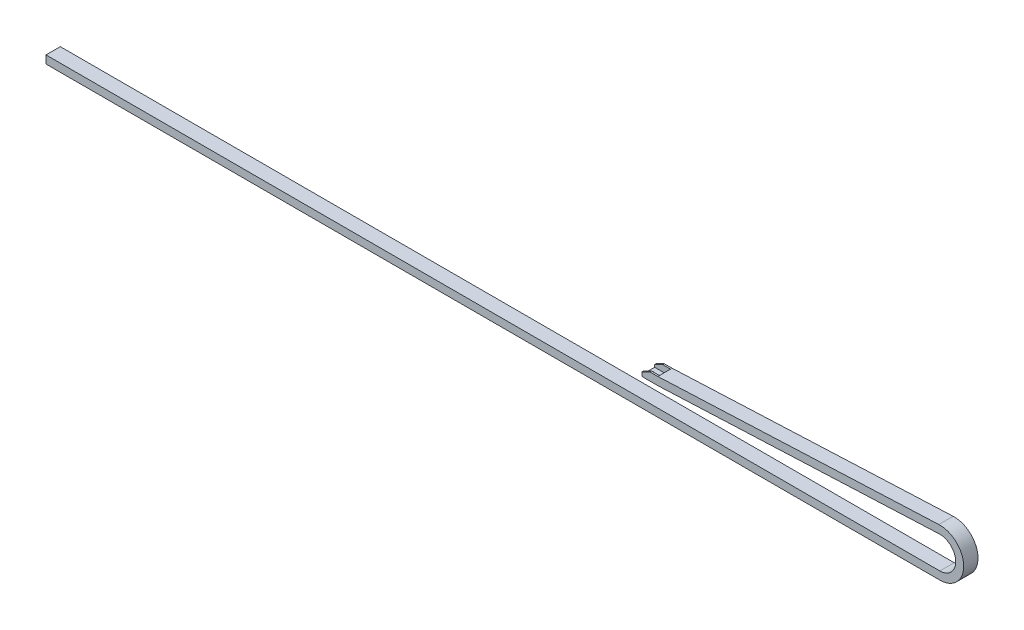
ISO-10303-21;
HEADER;
FILE_DESCRIPTION(('STEP AP214'),'2;1');
FILE_NAME('part.step','',(''),(''),'','','');
FILE_SCHEMA(('AUTOMOTIVE_DESIGN { 1 0 10303 214 1 1 1 1 }'));
ENDSEC;
DATA;
#1=APPLICATION_CONTEXT('core data for automotive mechanical design processes');
#2=APPLICATION_PROTOCOL_DEFINITION('international standard','automotive_design',2000,#1);
#3=PRODUCT_CONTEXT('',#1,'mechanical');
#4=PRODUCT('Part','Part','',(#3));
#5=PRODUCT_RELATED_PRODUCT_CATEGORY('part','',(#4));
#6=PRODUCT_DEFINITION_FORMATION('','',#4);
#7=PRODUCT_DEFINITION_CONTEXT('part definition',#1,'design');
#8=PRODUCT_DEFINITION('design','',#6,#7);
#9=PRODUCT_DEFINITION_SHAPE('','',#8);
#10=(LENGTH_UNIT() NAMED_UNIT(*) SI_UNIT(.MILLI.,.METRE.));
#11=(NAMED_UNIT(*) PLANE_ANGLE_UNIT() SI_UNIT($,.RADIAN.));
#12=(NAMED_UNIT(*) SI_UNIT($,.STERADIAN.) SOLID_ANGLE_UNIT());
#13=UNCERTAINTY_MEASURE_WITH_UNIT(LENGTH_MEASURE(1.E-05),#10,'distance_accuracy_value','');
#14=(GEOMETRIC_REPRESENTATION_CONTEXT(3) GLOBAL_UNCERTAINTY_ASSIGNED_CONTEXT((#13)) GLOBAL_UNIT_ASSIGNED_CONTEXT((#10,
#11,#12)) REPRESENTATION_CONTEXT('',''));
#15=CARTESIAN_POINT('',(0.,0.,0.));
#16=DIRECTION('',(0.,0.,1.));
#17=DIRECTION('',(1.,0.,0.));
#18=AXIS2_PLACEMENT_3D('',#15,#16,#17);
#19=CARTESIAN_POINT('',(0.,0.,18.));
#20=DIRECTION('',(1.,0.,0.));
#21=DIRECTION('',(0.,0.,-1.));
#22=AXIS2_PLACEMENT_3D('',#19,#20,#21);
#23=PLANE('',#22);
#24=DIRECTION('',(0.,-1.,0.));
#25=VECTOR('',#24,1.);
#26=CARTESIAN_POINT('',(0.,0.,0.));
#27=LINE('',#26,#25);
#28=CARTESIAN_POINT('',(0.,10.,0.));
#29=VERTEX_POINT('',#28);
#30=CARTESIAN_POINT('',(0.,0.,0.));
#31=VERTEX_POINT('',#30);
#32=EDGE_CURVE('E285',#29,#31,#27,.T.);
#33=ORIENTED_EDGE('',*,*,#32,.T.);
#34=DIRECTION('',(0.,0.,-1.));
#35=VECTOR('',#34,1.);
#36=CARTESIAN_POINT('',(0.,0.,18.));
#37=LINE('',#36,#35);
#38=CARTESIAN_POINT('',(0.,0.,18.));
#39=VERTEX_POINT('',#38);
#40=EDGE_CURVE('E48',#39,#31,#37,.T.);
#41=ORIENTED_EDGE('',*,*,#40,.F.);
#42=DIRECTION('',(0.,-1.,0.));
#43=VECTOR('',#42,1.);
#44=CARTESIAN_POINT('',(0.,0.,18.));
#45=LINE('',#44,#43);
#46=CARTESIAN_POINT('',(0.,10.,18.));
#47=VERTEX_POINT('',#46);
#48=EDGE_CURVE('E317',#47,#39,#45,.T.);
#49=ORIENTED_EDGE('',*,*,#48,.F.);
#50=DIRECTION('',(0.,0.,-1.));
#51=VECTOR('',#50,1.);
#52=CARTESIAN_POINT('',(0.,10.,18.));
#53=LINE('',#52,#51);
#54=EDGE_CURVE('E352',#47,#29,#53,.T.);
#55=ORIENTED_EDGE('',*,*,#54,.T.);
#56=EDGE_LOOP('',(#33,#41,#49,#55));
#57=FACE_BOUND('',#56,.T.);
#58=DIRECTION('',(0.,-1.,0.));
#59=VECTOR('',#58,1.);
#60=CARTESIAN_POINT('',(0.,0.,2.));
#61=LINE('',#60,#59);
#62=CARTESIAN_POINT('',(0.,8.,2.));
#63=VERTEX_POINT('',#62);
#64=CARTESIAN_POINT('',(0.,2.,2.));
#65=VERTEX_POINT('',#64);
#66=EDGE_CURVE('E208',#63,#65,#61,.T.);
#67=ORIENTED_EDGE('',*,*,#66,.F.);
#68=DIRECTION('',(0.,0.,-1.));
#69=VECTOR('',#68,1.);
#70=CARTESIAN_POINT('',(0.,8.,18.));
#71=LINE('',#70,#69);
#72=CARTESIAN_POINT('',(0.,8.,16.));
#73=VERTEX_POINT('',#72);
#74=EDGE_CURVE('E256',#73,#63,#71,.T.);
#75=ORIENTED_EDGE('',*,*,#74,.F.);
#76=DIRECTION('',(0.,-1.,0.));
#77=VECTOR('',#76,1.);
#78=CARTESIAN_POINT('',(0.,0.,16.));
#79=LINE('',#78,#77);
#80=CARTESIAN_POINT('',(0.,2.,16.));
#81=VERTEX_POINT('',#80);
#82=EDGE_CURVE('E63',#73,#81,#79,.T.);
#83=ORIENTED_EDGE('',*,*,#82,.T.);
#84=DIRECTION('',(0.,0.,-1.));
#85=VECTOR('',#84,1.);
#86=CARTESIAN_POINT('',(0.,2.,18.));
#87=LINE('',#86,#85);
#88=EDGE_CURVE('E221',#81,#65,#87,.T.);
#89=ORIENTED_EDGE('',*,*,#88,.T.);
#90=EDGE_LOOP('',(#67,#75,#83,#89));
#91=FACE_BOUND('',#90,.T.);
#92=ADVANCED_FACE('F45',(#57,#91),#23,.F.);
#93=CARTESIAN_POINT('',(760.,44.4904347529898,18.));
#94=DIRECTION('',(0.,-1.,0.));
#95=DIRECTION('',(0.,0.,-1.));
#96=AXIS2_PLACEMENT_3D('',#93,#94,#95);
#97=PLANE('',#96);
#98=DIRECTION('',(-1.,0.,0.));
#99=VECTOR('',#98,1.);
#100=CARTESIAN_POINT('',(760.,44.4904347529898,2.));
#101=LINE('',#100,#99);
#102=CARTESIAN_POINT('',(770.,44.4904347529898,2.));
#103=VERTEX_POINT('',#102);
#104=CARTESIAN_POINT('',(760.,44.4904347529898,2.));
#105=VERTEX_POINT('',#104);
#106=EDGE_CURVE('E11',#103,#105,#101,.T.);
#107=ORIENTED_EDGE('',*,*,#106,.F.);
#108=DIRECTION('',(0.,0.,-1.));
#109=VECTOR('',#108,1.);
#110=CARTESIAN_POINT('',(770.,44.4904347529898,18.));
#111=LINE('',#110,#109);
#112=CARTESIAN_POINT('',(770.,44.4904347529898,0.));
#113=VERTEX_POINT('',#112);
#114=EDGE_CURVE('E417',#103,#113,#111,.T.);
#115=ORIENTED_EDGE('',*,*,#114,.T.);
#116=DIRECTION('',(-1.,0.,0.));
#117=VECTOR('',#116,1.);
#118=CARTESIAN_POINT('',(760.,44.4904347529898,0.));
#119=LINE('',#118,#117);
#120=CARTESIAN_POINT('',(760.,44.4904347529898,0.));
#121=VERTEX_POINT('',#120);
#122=EDGE_CURVE('E366',#113,#121,#119,.T.);
#123=ORIENTED_EDGE('',*,*,#122,.T.);
#124=DIRECTION('',(0.,0.,-1.));
#125=VECTOR('',#124,1.);
#126=CARTESIAN_POINT('',(760.,44.4904347529898,18.));
#127=LINE('',#126,#125);
#128=EDGE_CURVE('E412',#105,#121,#127,.T.);
#129=ORIENTED_EDGE('',*,*,#128,.F.);
#130=EDGE_LOOP('',(#107,#115,#123,#129));
#131=FACE_BOUND('',#130,.T.);
#132=ADVANCED_FACE('F465',(#131),#97,.F.);
#133=CARTESIAN_POINT('',(750.,39.5,18.));
#134=DIRECTION('',(0.446528769332539,-0.894769276494431,0.));
#135=DIRECTION('',(0.894769276494431,0.446528769332539,0.));
#136=AXIS2_PLACEMENT_3D('',#133,#134,#135);
#137=PLANE('',#136);
#138=DIRECTION('',(-0.894769276494431,-0.446528769332539,0.));
#139=VECTOR('',#138,1.);
#140=CARTESIAN_POINT('',(750.,39.5,2.));
#141=LINE('',#140,#139);
#142=CARTESIAN_POINT('',(750.,39.5,2.));
#143=VERTEX_POINT('',#142);
#144=EDGE_CURVE('E299',#105,#143,#141,.T.);
#145=ORIENTED_EDGE('',*,*,#144,.F.);
#146=ORIENTED_EDGE('',*,*,#128,.T.);
#147=DIRECTION('',(-0.894769276494432,-0.446528769332539,0.));
#148=VECTOR('',#147,1.);
#149=CARTESIAN_POINT('',(750.,39.5,0.));
#150=LINE('',#149,#148);
#151=CARTESIAN_POINT('',(750.,39.5,0.));
#152=VERTEX_POINT('',#151);
#153=EDGE_CURVE('E370',#121,#152,#150,.T.);
#154=ORIENTED_EDGE('',*,*,#153,.T.);
#155=DIRECTION('',(0.,0.,-1.));
#156=VECTOR('',#155,1.);
#157=CARTESIAN_POINT('',(750.,39.5,18.));
#158=LINE('',#157,#156);
#159=EDGE_CURVE('E407',#143,#152,#158,.T.);
#160=ORIENTED_EDGE('',*,*,#159,.F.);
#161=EDGE_LOOP('',(#145,#146,#154,#160));
#162=FACE_BOUND('',#161,.T.);
#163=ADVANCED_FACE('F478',(#162),#137,.F.);
#164=CARTESIAN_POINT('',(750.,34.5,18.));
#165=DIRECTION('',(1.,0.,0.));
#166=DIRECTION('',(0.,0.,-1.));
#167=AXIS2_PLACEMENT_3D('',#164,#165,#166);
#168=PLANE('',#167);
#169=DIRECTION('',(0.,-1.,0.));
#170=VECTOR('',#169,1.);
#171=CARTESIAN_POINT('',(750.,34.5,2.));
#172=LINE('',#171,#170);
#173=CARTESIAN_POINT('',(750.,36.5,2.));
#174=VERTEX_POINT('',#173);
#175=EDGE_CURVE('E261',#143,#174,#172,.T.);
#176=ORIENTED_EDGE('',*,*,#175,.F.);
#177=ORIENTED_EDGE('',*,*,#159,.T.);
#178=DIRECTION('',(0.,-1.,0.));
#179=VECTOR('',#178,1.);
#180=CARTESIAN_POINT('',(750.,34.5,0.));
#181=LINE('',#180,#179);
#182=CARTESIAN_POINT('',(750.,34.5,0.));
#183=VERTEX_POINT('',#182);
#184=EDGE_CURVE('E374',#152,#183,#181,.T.);
#185=ORIENTED_EDGE('',*,*,#184,.T.);
#186=DIRECTION('',(0.,0.,-1.));
#187=VECTOR('',#186,1.);
#188=CARTESIAN_POINT('',(750.,34.5,18.));
#189=LINE('',#188,#187);
#190=CARTESIAN_POINT('',(750.,34.5,18.));
#191=VERTEX_POINT('',#190);
#192=EDGE_CURVE('E403',#191,#183,#189,.T.);
#193=ORIENTED_EDGE('',*,*,#192,.F.);
#194=DIRECTION('',(0.,-1.,0.));
#195=VECTOR('',#194,1.);
#196=CARTESIAN_POINT('',(750.,34.5,18.));
#197=LINE('',#196,#195);
#198=CARTESIAN_POINT('',(750.,39.5,18.));
#199=VERTEX_POINT('',#198);
#200=EDGE_CURVE('E337',#199,#191,#197,.T.);
#201=ORIENTED_EDGE('',*,*,#200,.F.);
#202=CARTESIAN_POINT('',(750.,39.5,16.));
#203=VERTEX_POINT('',#202);
#204=EDGE_CURVE('E408',#199,#203,#158,.T.);
#205=ORIENTED_EDGE('',*,*,#204,.T.);
#206=DIRECTION('',(0.,-1.,0.));
#207=VECTOR('',#206,1.);
#208=CARTESIAN_POINT('',(750.,34.5,16.));
#209=LINE('',#208,#207);
#210=CARTESIAN_POINT('',(750.,36.5,16.));
#211=VERTEX_POINT('',#210);
#212=EDGE_CURVE('E247',#203,#211,#209,.T.);
#213=ORIENTED_EDGE('',*,*,#212,.T.);
#214=DIRECTION('',(0.,0.,-1.));
#215=VECTOR('',#214,1.);
#216=CARTESIAN_POINT('',(750.,36.5,18.));
#217=LINE('',#216,#215);
#218=EDGE_CURVE('E266',#211,#174,#217,.T.);
#219=ORIENTED_EDGE('',*,*,#218,.T.);
#220=EDGE_LOOP('',(#176,#177,#185,#193,#201,#205,#213,#219));
#221=FACE_BOUND('',#220,.T.);
#222=ADVANCED_FACE('F484',(#221),#168,.F.);
#223=CARTESIAN_POINT('',(0.,0.,18.));
#224=DIRECTION('',(0.,1.,0.));
#225=DIRECTION('',(0.,0.,1.));
#226=AXIS2_PLACEMENT_3D('',#223,#224,#225);
#227=PLANE('',#226);
#228=DIRECTION('',(1.,0.,0.));
#229=VECTOR('',#228,1.);
#230=CARTESIAN_POINT('',(0.,0.,0.));
#231=LINE('',#230,#229);
#232=CARTESIAN_POINT('',(1125.,0.,0.));
#233=VERTEX_POINT('',#232);
#234=EDGE_CURVE('E356',#31,#233,#231,.T.);
#235=ORIENTED_EDGE('',*,*,#234,.T.);
#236=DIRECTION('',(0.,0.,-1.));
#237=VECTOR('',#236,1.);
#238=CARTESIAN_POINT('',(1125.,0.,18.));
#239=LINE('',#238,#237);
#240=CARTESIAN_POINT('',(1125.,0.,18.));
#241=VERTEX_POINT('',#240);
#242=EDGE_CURVE('E426',#241,#233,#239,.T.);
#243=ORIENTED_EDGE('',*,*,#242,.F.);
#244=DIRECTION('',(1.,0.,0.));
#245=VECTOR('',#244,1.);
#246=CARTESIAN_POINT('',(0.,0.,18.));
#247=LINE('',#246,#245);
#248=EDGE_CURVE('E321',#39,#241,#247,.T.);
#249=ORIENTED_EDGE('',*,*,#248,.F.);
#250=ORIENTED_EDGE('',*,*,#40,.T.);
#251=EDGE_LOOP('',(#235,#243,#249,#250));
#252=FACE_BOUND('',#251,.T.);
#253=ADVANCED_FACE('F514',(#252),#227,.F.);
#254=CARTESIAN_POINT('',(1125.,30.0000000000001,18.));
#255=DIRECTION('',(0.,0.,-1.));
#256=DIRECTION('',(-1.,0.,0.));
#257=AXIS2_PLACEMENT_3D('',#254,#255,#256);
#258=CYLINDRICAL_SURFACE('',#257,30.);
#259=CARTESIAN_POINT('',(1125.,30.0000000000001,0.));
#260=DIRECTION('',(0.,0.,1.));
#261=DIRECTION('',(1.,0.,0.));
#262=AXIS2_PLACEMENT_3D('',#259,#260,#261);
#263=CIRCLE('',#262,30.);
#264=CARTESIAN_POINT('',(1123.68816120796,59.9713042589693,0.));
#265=VERTEX_POINT('',#264);
#266=EDGE_CURVE('E359',#233,#265,#263,.T.);
#267=ORIENTED_EDGE('',*,*,#266,.T.);
#268=DIRECTION('',(0.,0.,-1.));
#269=VECTOR('',#268,1.);
#270=CARTESIAN_POINT('',(1123.68816120796,59.9713042589693,18.));
#271=LINE('',#270,#269);
#272=CARTESIAN_POINT('',(1123.68816120796,59.9713042589693,18.));
#273=VERTEX_POINT('',#272);
#274=EDGE_CURVE('E422',#273,#265,#271,.T.);
#275=ORIENTED_EDGE('',*,*,#274,.F.);
#276=CARTESIAN_POINT('',(1125.,30.0000000000001,18.));
#277=DIRECTION('',(0.,0.,1.));
#278=DIRECTION('',(1.,0.,0.));
#279=AXIS2_PLACEMENT_3D('',#276,#277,#278);
#280=CIRCLE('',#279,30.);
#281=EDGE_CURVE('E325',#241,#273,#280,.T.);
#282=ORIENTED_EDGE('',*,*,#281,.F.);
#283=ORIENTED_EDGE('',*,*,#242,.T.);
#284=EDGE_LOOP('',(#267,#275,#282,#283));
#285=FACE_BOUND('',#284,.T.);
#286=ADVANCED_FACE('F515',(#285),#258,.T.);
#287=CARTESIAN_POINT('',(1123.68816120796,59.9713042589693,18.));
#288=DIRECTION('',(0.0437279597345918,-0.999043475298973,0.));
#289=DIRECTION('',(0.999043475298973,0.0437279597345918,0.));
#290=AXIS2_PLACEMENT_3D('',#287,#288,#289);
#291=PLANE('',#290);
#292=DIRECTION('',(-0.999043475298973,-0.0437279597345918,0.));
#293=VECTOR('',#292,1.);
#294=CARTESIAN_POINT('',(1123.68816120796,59.9713042589693,0.));
#295=LINE('',#294,#293);
#296=EDGE_CURVE('E362',#265,#113,#295,.T.);
#297=ORIENTED_EDGE('',*,*,#296,.T.);
#298=ORIENTED_EDGE('',*,*,#114,.F.);
#299=CARTESIAN_POINT('',(770.,44.4904347529898,16.));
#300=VERTEX_POINT('',#299);
#301=EDGE_CURVE('E423',#300,#103,#111,.T.);
#302=ORIENTED_EDGE('',*,*,#301,.F.);
#303=CARTESIAN_POINT('',(770.,44.4904347529898,18.));
#304=VERTEX_POINT('',#303);
#305=EDGE_CURVE('E418',#304,#300,#111,.T.);
#306=ORIENTED_EDGE('',*,*,#305,.F.);
#307=DIRECTION('',(-0.999043475298973,-0.0437279597345918,0.));
#308=VECTOR('',#307,1.);
#309=CARTESIAN_POINT('',(1123.68816120796,59.9713042589693,18.));
#310=LINE('',#309,#308);
#311=EDGE_CURVE('E328',#273,#304,#310,.T.);
#312=ORIENTED_EDGE('',*,*,#311,.F.);
#313=ORIENTED_EDGE('',*,*,#274,.T.);
#314=EDGE_LOOP('',(#297,#298,#302,#306,#312,#313));
#315=FACE_BOUND('',#314,.T.);
#316=ADVANCED_FACE('F457',(#315),#291,.F.);
#317=ORIENTED_EDGE('',*,*,#305,.T.);
#318=DIRECTION('',(-1.,0.,0.));
#319=VECTOR('',#318,1.);
#320=CARTESIAN_POINT('',(760.,44.4904347529898,16.));
#321=LINE('',#320,#319);
#322=CARTESIAN_POINT('',(760.,44.4904347529898,16.));
#323=VERTEX_POINT('',#322);
#324=EDGE_CURVE('E54',#300,#323,#321,.T.);
#325=ORIENTED_EDGE('',*,*,#324,.T.);
#326=CARTESIAN_POINT('',(760.,44.4904347529898,18.));
#327=VERTEX_POINT('',#326);
#328=EDGE_CURVE('E413',#327,#323,#127,.T.);
#329=ORIENTED_EDGE('',*,*,#328,.F.);
#330=DIRECTION('',(-1.,0.,0.));
#331=VECTOR('',#330,1.);
#332=CARTESIAN_POINT('',(760.,44.4904347529898,18.));
#333=LINE('',#332,#331);
#334=EDGE_CURVE('E331',#304,#327,#333,.T.);
#335=ORIENTED_EDGE('',*,*,#334,.F.);
#336=EDGE_LOOP('',(#317,#325,#329,#335));
#337=FACE_BOUND('',#336,.T.);
#338=ADVANCED_FACE('F441',(#337),#97,.F.);
#339=ORIENTED_EDGE('',*,*,#328,.T.);
#340=DIRECTION('',(-0.894769276494431,-0.446528769332539,0.));
#341=VECTOR('',#340,1.);
#342=CARTESIAN_POINT('',(750.,39.5,16.));
#343=LINE('',#342,#341);
#344=EDGE_CURVE('E310',#323,#203,#343,.T.);
#345=ORIENTED_EDGE('',*,*,#344,.T.);
#346=ORIENTED_EDGE('',*,*,#204,.F.);
#347=DIRECTION('',(-0.894769276494432,-0.446528769332539,0.));
#348=VECTOR('',#347,1.);
#349=CARTESIAN_POINT('',(750.,39.5,18.));
#350=LINE('',#349,#348);
#351=EDGE_CURVE('E334',#327,#199,#350,.T.);
#352=ORIENTED_EDGE('',*,*,#351,.F.);
#353=EDGE_LOOP('',(#339,#345,#346,#352));
#354=FACE_BOUND('',#353,.T.);
#355=ADVANCED_FACE('F447',(#354),#137,.F.);
#356=CARTESIAN_POINT('',(770.437279597346,34.5000000000001,18.));
#357=DIRECTION('',(0.,1.,0.));
#358=DIRECTION('',(-1.,0.,0.));
#359=AXIS2_PLACEMENT_3D('',#356,#357,#358);
#360=PLANE('',#359);
#361=CARTESIAN_POINT('',(754.,34.5,9.));
#362=DIRECTION('',(0.,1.,0.));
#363=DIRECTION('',(-1.,0.,0.));
#364=AXIS2_PLACEMENT_3D('',#361,#362,#363);
#365=CIRCLE('',#364,1.49999999999997);
#366=CARTESIAN_POINT('',(752.5,34.5,9.));
#367=VERTEX_POINT('',#366);
#368=EDGE_CURVE('E293',#367,#367,#365,.F.);
#369=ORIENTED_EDGE('',*,*,#368,.F.);
#370=EDGE_LOOP('',(#369));
#371=FACE_BOUND('',#370,.T.);
#372=CARTESIAN_POINT('',(762.,34.5000000000001,9.));
#373=DIRECTION('',(0.,1.,0.));
#374=DIRECTION('',(-1.,0.,0.));
#375=AXIS2_PLACEMENT_3D('',#372,#373,#374);
#376=CIRCLE('',#375,1.49999999999997);
#377=CARTESIAN_POINT('',(760.5,34.5000000000001,9.));
#378=VERTEX_POINT('',#377);
#379=EDGE_CURVE('E594',#378,#378,#376,.F.);
#380=ORIENTED_EDGE('',*,*,#379,.F.);
#381=EDGE_LOOP('',(#380));
#382=FACE_BOUND('',#381,.T.);
#383=DIRECTION('',(1.,0.,0.));
#384=VECTOR('',#383,1.);
#385=CARTESIAN_POINT('',(770.437279597346,34.5000000000001,0.));
#386=LINE('',#385,#384);
#387=CARTESIAN_POINT('',(770.437279597346,34.5000000000001,0.));
#388=VERTEX_POINT('',#387);
#389=EDGE_CURVE('E377',#183,#388,#386,.T.);
#390=ORIENTED_EDGE('',*,*,#389,.T.);
#391=DIRECTION('',(0.,0.,-1.));
#392=VECTOR('',#391,1.);
#393=CARTESIAN_POINT('',(770.437279597346,34.5000000000001,18.));
#394=LINE('',#393,#392);
#395=CARTESIAN_POINT('',(770.437279597346,34.5000000000001,18.));
#396=VERTEX_POINT('',#395);
#397=EDGE_CURVE('E399',#396,#388,#394,.T.);
#398=ORIENTED_EDGE('',*,*,#397,.F.);
#399=DIRECTION('',(1.,0.,0.));
#400=VECTOR('',#399,1.);
#401=CARTESIAN_POINT('',(770.437279597346,34.5000000000001,18.));
#402=LINE('',#401,#400);
#403=EDGE_CURVE('E340',#191,#396,#402,.T.);
#404=ORIENTED_EDGE('',*,*,#403,.F.);
#405=ORIENTED_EDGE('',*,*,#192,.T.);
#406=EDGE_LOOP('',(#390,#398,#404,#405));
#407=FACE_BOUND('',#406,.T.);
#408=ADVANCED_FACE('F528',(#371,#382,#407),#360,.F.);
#409=CARTESIAN_POINT('',(1124.12544080531,49.9808695059795,18.));
#410=DIRECTION('',(-0.0437279597345918,0.999043475298973,0.));
#411=DIRECTION('',(-0.999043475298973,-0.0437279597345918,0.));
#412=AXIS2_PLACEMENT_3D('',#409,#410,#411);
#413=PLANE('',#412);
#414=DIRECTION('',(0.999043475298973,0.0437279597345918,0.));
#415=VECTOR('',#414,1.);
#416=CARTESIAN_POINT('',(1124.12544080531,49.9808695059795,0.));
#417=LINE('',#416,#415);
#418=CARTESIAN_POINT('',(1124.12544080531,49.9808695059795,0.));
#419=VERTEX_POINT('',#418);
#420=EDGE_CURVE('E380',#388,#419,#417,.T.);
#421=ORIENTED_EDGE('',*,*,#420,.T.);
#422=DIRECTION('',(0.,0.,-1.));
#423=VECTOR('',#422,1.);
#424=CARTESIAN_POINT('',(1124.12544080531,49.9808695059795,18.));
#425=LINE('',#424,#423);
#426=CARTESIAN_POINT('',(1124.12544080531,49.9808695059795,18.));
#427=VERTEX_POINT('',#426);
#428=EDGE_CURVE('E395',#427,#419,#425,.T.);
#429=ORIENTED_EDGE('',*,*,#428,.F.);
#430=DIRECTION('',(0.999043475298973,0.0437279597345918,0.));
#431=VECTOR('',#430,1.);
#432=CARTESIAN_POINT('',(1124.12544080531,49.9808695059795,18.));
#433=LINE('',#432,#431);
#434=EDGE_CURVE('E343',#396,#427,#433,.T.);
#435=ORIENTED_EDGE('',*,*,#434,.F.);
#436=ORIENTED_EDGE('',*,*,#397,.T.);
#437=EDGE_LOOP('',(#421,#429,#435,#436));
#438=FACE_BOUND('',#437,.T.);
#439=ADVANCED_FACE('F533',(#438),#413,.F.);
#440=CARTESIAN_POINT('',(1125.,30.0000000000001,18.));
#441=DIRECTION('',(0.,0.,-1.));
#442=DIRECTION('',(-1.,0.,0.));
#443=AXIS2_PLACEMENT_3D('',#440,#441,#442);
#444=CYLINDRICAL_SURFACE('',#443,20.);
#445=CARTESIAN_POINT('',(1125.,30.0000000000001,0.));
#446=DIRECTION('',(0.,0.,-1.));
#447=DIRECTION('',(1.,0.,0.));
#448=AXIS2_PLACEMENT_3D('',#445,#446,#447);
#449=CIRCLE('',#448,20.);
#450=CARTESIAN_POINT('',(1125.,10.0000000000001,0.));
#451=VERTEX_POINT('',#450);
#452=EDGE_CURVE('E383',#419,#451,#449,.T.);
#453=ORIENTED_EDGE('',*,*,#452,.T.);
#454=DIRECTION('',(0.,0.,-1.));
#455=VECTOR('',#454,1.);
#456=CARTESIAN_POINT('',(1125.,10.0000000000001,18.));
#457=LINE('',#456,#455);
#458=CARTESIAN_POINT('',(1125.,10.0000000000001,18.));
#459=VERTEX_POINT('',#458);
#460=EDGE_CURVE('E391',#459,#451,#457,.T.);
#461=ORIENTED_EDGE('',*,*,#460,.F.);
#462=CARTESIAN_POINT('',(1125.,30.0000000000001,18.));
#463=DIRECTION('',(0.,0.,-1.));
#464=DIRECTION('',(1.,0.,0.));
#465=AXIS2_PLACEMENT_3D('',#462,#463,#464);
#466=CIRCLE('',#465,20.);
#467=EDGE_CURVE('E346',#427,#459,#466,.T.);
#468=ORIENTED_EDGE('',*,*,#467,.F.);
#469=ORIENTED_EDGE('',*,*,#428,.T.);
#470=EDGE_LOOP('',(#453,#461,#468,#469));
#471=FACE_BOUND('',#470,.T.);
#472=ADVANCED_FACE('F536',(#471),#444,.F.);
#473=CARTESIAN_POINT('',(0.,10.,18.));
#474=DIRECTION('',(0.,-1.,0.));
#475=DIRECTION('',(1.,0.,0.));
#476=AXIS2_PLACEMENT_3D('',#473,#474,#475);
#477=PLANE('',#476);
#478=DIRECTION('',(-1.,0.,0.));
#479=VECTOR('',#478,1.);
#480=CARTESIAN_POINT('',(0.,10.,0.));
#481=LINE('',#480,#479);
#482=EDGE_CURVE('E322',#451,#29,#481,.T.);
#483=ORIENTED_EDGE('',*,*,#482,.T.);
#484=ORIENTED_EDGE('',*,*,#54,.F.);
#485=DIRECTION('',(-1.,0.,0.));
#486=VECTOR('',#485,1.);
#487=CARTESIAN_POINT('',(0.,10.,18.));
#488=LINE('',#487,#486);
#489=EDGE_CURVE('E349',#459,#47,#488,.T.);
#490=ORIENTED_EDGE('',*,*,#489,.F.);
#491=ORIENTED_EDGE('',*,*,#460,.T.);
#492=EDGE_LOOP('',(#483,#484,#490,#491));
#493=FACE_BOUND('',#492,.T.);
#494=ADVANCED_FACE('F540',(#493),#477,.F.);
#495=CARTESIAN_POINT('',(1125.,30.0000000000001,18.));
#496=DIRECTION('',(0.,0.,1.));
#497=DIRECTION('',(1.,0.,0.));
#498=AXIS2_PLACEMENT_3D('',#495,#496,#497);
#499=PLANE('',#498);
#500=ORIENTED_EDGE('',*,*,#48,.T.);
#501=ORIENTED_EDGE('',*,*,#248,.T.);
#502=ORIENTED_EDGE('',*,*,#281,.T.);
#503=ORIENTED_EDGE('',*,*,#311,.T.);
#504=ORIENTED_EDGE('',*,*,#334,.T.);
#505=ORIENTED_EDGE('',*,*,#351,.T.);
#506=ORIENTED_EDGE('',*,*,#200,.T.);
#507=ORIENTED_EDGE('',*,*,#403,.T.);
#508=ORIENTED_EDGE('',*,*,#434,.T.);
#509=ORIENTED_EDGE('',*,*,#467,.T.);
#510=ORIENTED_EDGE('',*,*,#489,.T.);
#511=EDGE_LOOP('',(#500,#501,#502,#503,#504,#505,#506,#507,#508,#509,#510));
#512=FACE_BOUND('',#511,.T.);
#513=ADVANCED_FACE('F451',(#512),#499,.T.);
#514=CARTESIAN_POINT('',(1125.,30.0000000000001,0.));
#515=DIRECTION('',(0.,0.,1.));
#516=DIRECTION('',(1.,0.,0.));
#517=AXIS2_PLACEMENT_3D('',#514,#515,#516);
#518=PLANE('',#517);
#519=ORIENTED_EDGE('',*,*,#32,.F.);
#520=ORIENTED_EDGE('',*,*,#482,.F.);
#521=ORIENTED_EDGE('',*,*,#452,.F.);
#522=ORIENTED_EDGE('',*,*,#420,.F.);
#523=ORIENTED_EDGE('',*,*,#389,.F.);
#524=ORIENTED_EDGE('',*,*,#184,.F.);
#525=ORIENTED_EDGE('',*,*,#153,.F.);
#526=ORIENTED_EDGE('',*,*,#122,.F.);
#527=ORIENTED_EDGE('',*,*,#296,.F.);
#528=ORIENTED_EDGE('',*,*,#266,.F.);
#529=ORIENTED_EDGE('',*,*,#234,.F.);
#530=EDGE_LOOP('',(#519,#520,#521,#522,#523,#524,#525,#526,#527,#528,#529));
#531=FACE_BOUND('',#530,.T.);
#532=ADVANCED_FACE('F472',(#531),#518,.F.);
#533=CARTESIAN_POINT('',(760.,44.4904347529898,18.));
#534=DIRECTION('',(0.,-1.,0.));
#535=DIRECTION('',(0.,0.,-1.));
#536=AXIS2_PLACEMENT_3D('',#533,#534,#535);
#537=PLANE('',#536);
#538=ORIENTED_EDGE('',*,*,#301,.T.);
#539=CARTESIAN_POINT('',(815.737327150388,44.4904347529898,2.));
#540=VERTEX_POINT('',#539);
#541=EDGE_CURVE('E56',#540,#103,#101,.T.);
#542=ORIENTED_EDGE('',*,*,#541,.F.);
#543=DIRECTION('',(0.,0.,-1.));
#544=VECTOR('',#543,1.);
#545=CARTESIAN_POINT('',(815.737327150388,44.4904347529898,18.));
#546=LINE('',#545,#544);
#547=CARTESIAN_POINT('',(815.737327150388,44.4904347529898,16.));
#548=VERTEX_POINT('',#547);
#549=EDGE_CURVE('E236',#548,#540,#546,.T.);
#550=ORIENTED_EDGE('',*,*,#549,.F.);
#551=EDGE_CURVE('E243',#548,#300,#321,.T.);
#552=ORIENTED_EDGE('',*,*,#551,.T.);
#553=EDGE_LOOP('',(#538,#542,#550,#552));
#554=FACE_BOUND('',#553,.T.);
#555=ADVANCED_FACE('F546',(#554),#537,.T.);
#556=CARTESIAN_POINT('',(0.,2.,18.));
#557=DIRECTION('',(0.,1.,0.));
#558=DIRECTION('',(0.,0.,1.));
#559=AXIS2_PLACEMENT_3D('',#556,#557,#558);
#560=PLANE('',#559);
#561=DIRECTION('',(1.,0.,0.));
#562=VECTOR('',#561,1.);
#563=CARTESIAN_POINT('',(0.,2.,2.));
#564=LINE('',#563,#562);
#565=CARTESIAN_POINT('',(1125.,2.00000000000006,2.));
#566=VERTEX_POINT('',#565);
#567=EDGE_CURVE('E201',#65,#566,#564,.T.);
#568=ORIENTED_EDGE('',*,*,#567,.F.);
#569=ORIENTED_EDGE('',*,*,#88,.F.);
#570=DIRECTION('',(1.,0.,0.));
#571=VECTOR('',#570,1.);
#572=CARTESIAN_POINT('',(0.,2.,16.));
#573=LINE('',#572,#571);
#574=CARTESIAN_POINT('',(1125.,2.00000000000006,16.));
#575=VERTEX_POINT('',#574);
#576=EDGE_CURVE('E217',#81,#575,#573,.T.);
#577=ORIENTED_EDGE('',*,*,#576,.T.);
#578=DIRECTION('',(0.,0.,-1.));
#579=VECTOR('',#578,1.);
#580=CARTESIAN_POINT('',(1125.,2.00000000000006,18.));
#581=LINE('',#580,#579);
#582=EDGE_CURVE('E215',#575,#566,#581,.T.);
#583=ORIENTED_EDGE('',*,*,#582,.T.);
#584=EDGE_LOOP('',(#568,#569,#577,#583));
#585=FACE_BOUND('',#584,.T.);
#586=ADVANCED_FACE('F216',(#585),#560,.T.);
#587=CARTESIAN_POINT('',(1125.,30.0000000000001,18.));
#588=DIRECTION('',(0.,0.,-1.));
#589=DIRECTION('',(-1.,0.,0.));
#590=AXIS2_PLACEMENT_3D('',#587,#588,#589);
#591=CYLINDRICAL_SURFACE('',#590,28.);
#592=CARTESIAN_POINT('',(1125.,30.0000000000001,2.));
#593=DIRECTION('',(0.,0.,1.));
#594=DIRECTION('',(1.,0.,0.));
#595=AXIS2_PLACEMENT_3D('',#592,#593,#594);
#596=CIRCLE('',#595,28.);
#597=CARTESIAN_POINT('',(1123.77561712743,57.9732173083713,2.));
#598=VERTEX_POINT('',#597);
#599=EDGE_CURVE('E205',#566,#598,#596,.T.);
#600=ORIENTED_EDGE('',*,*,#599,.F.);
#601=ORIENTED_EDGE('',*,*,#582,.F.);
#602=CARTESIAN_POINT('',(1125.,30.0000000000001,16.));
#603=DIRECTION('',(0.,0.,1.));
#604=DIRECTION('',(1.,0.,0.));
#605=AXIS2_PLACEMENT_3D('',#602,#603,#604);
#606=CIRCLE('',#605,28.);
#607=CARTESIAN_POINT('',(1123.77561712743,57.9732173083713,16.));
#608=VERTEX_POINT('',#607);
#609=EDGE_CURVE('E237',#575,#608,#606,.T.);
#610=ORIENTED_EDGE('',*,*,#609,.T.);
#611=DIRECTION('',(0.,0.,1.));
#612=VECTOR('',#611,1.);
#613=CARTESIAN_POINT('',(1123.77561712743,57.9732173083713,18.));
#614=LINE('',#613,#612);
#615=EDGE_CURVE('E222',#608,#598,#614,.F.);
#616=ORIENTED_EDGE('',*,*,#615,.T.);
#617=EDGE_LOOP('',(#600,#601,#610,#616));
#618=FACE_BOUND('',#617,.T.);
#619=ADVANCED_FACE('F224',(#618),#591,.F.);
#620=CARTESIAN_POINT('',(1123.77561712743,57.9732173083713,18.));
#621=DIRECTION('',(0.0437279597345918,-0.999043475298973,0.));
#622=DIRECTION('',(0.999043475298973,0.0437279597345918,0.));
#623=AXIS2_PLACEMENT_3D('',#620,#621,#622);
#624=PLANE('',#623);
#625=DIRECTION('',(-0.999043475298973,-0.0437279597345918,0.));
#626=VECTOR('',#625,1.);
#627=CARTESIAN_POINT('',(1123.77561712743,57.9732173083713,2.));
#628=LINE('',#627,#626);
#629=EDGE_CURVE('E228',#598,#540,#628,.T.);
#630=ORIENTED_EDGE('',*,*,#629,.F.);
#631=ORIENTED_EDGE('',*,*,#615,.F.);
#632=DIRECTION('',(-0.999043475298973,-0.0437279597345918,0.));
#633=VECTOR('',#632,1.);
#634=CARTESIAN_POINT('',(1123.77561712743,57.9732173083713,16.));
#635=LINE('',#634,#633);
#636=EDGE_CURVE('E239',#608,#548,#635,.T.);
#637=ORIENTED_EDGE('',*,*,#636,.T.);
#638=ORIENTED_EDGE('',*,*,#549,.T.);
#639=EDGE_LOOP('',(#630,#631,#637,#638));
#640=FACE_BOUND('',#639,.T.);
#641=ADVANCED_FACE('F563',(#640),#624,.T.);
#642=CARTESIAN_POINT('',(770.437279597346,36.5000000000001,18.));
#643=DIRECTION('',(0.,1.,0.));
#644=DIRECTION('',(-1.,0.,0.));
#645=AXIS2_PLACEMENT_3D('',#642,#643,#644);
#646=PLANE('',#645);
#647=CARTESIAN_POINT('',(754.,36.5,9.));
#648=DIRECTION('',(0.,1.,0.));
#649=DIRECTION('',(-1.,0.,0.));
#650=AXIS2_PLACEMENT_3D('',#647,#648,#649);
#651=CIRCLE('',#650,1.49999999999997);
#652=CARTESIAN_POINT('',(752.5,36.5,9.));
#653=VERTEX_POINT('',#652);
#654=EDGE_CURVE('E585',#653,#653,#651,.T.);
#655=ORIENTED_EDGE('',*,*,#654,.F.);
#656=EDGE_LOOP('',(#655));
#657=FACE_BOUND('',#656,.T.);
#658=CARTESIAN_POINT('',(762.,36.5000000000001,9.));
#659=DIRECTION('',(0.,1.,0.));
#660=DIRECTION('',(-1.,0.,0.));
#661=AXIS2_PLACEMENT_3D('',#658,#659,#660);
#662=CIRCLE('',#661,1.49999999999997);
#663=CARTESIAN_POINT('',(760.5,36.5000000000001,9.));
#664=VERTEX_POINT('',#663);
#665=EDGE_CURVE('E591',#664,#664,#662,.T.);
#666=ORIENTED_EDGE('',*,*,#665,.F.);
#667=EDGE_LOOP('',(#666));
#668=FACE_BOUND('',#667,.T.);
#669=DIRECTION('',(1.,0.,0.));
#670=VECTOR('',#669,1.);
#671=CARTESIAN_POINT('',(770.437279597346,36.5000000000001,2.));
#672=LINE('',#671,#670);
#673=CARTESIAN_POINT('',(770.393530714168,36.5000000000001,2.));
#674=VERTEX_POINT('',#673);
#675=EDGE_CURVE('E257',#174,#674,#672,.T.);
#676=ORIENTED_EDGE('',*,*,#675,.F.);
#677=ORIENTED_EDGE('',*,*,#218,.F.);
#678=DIRECTION('',(1.,0.,0.));
#679=VECTOR('',#678,1.);
#680=CARTESIAN_POINT('',(770.437279597346,36.5000000000001,16.));
#681=LINE('',#680,#679);
#682=CARTESIAN_POINT('',(770.393530714168,36.5000000000001,16.));
#683=VERTEX_POINT('',#682);
#684=EDGE_CURVE('E70',#211,#683,#681,.T.);
#685=ORIENTED_EDGE('',*,*,#684,.T.);
#686=DIRECTION('',(0.,0.,-1.));
#687=VECTOR('',#686,1.);
#688=CARTESIAN_POINT('',(770.393530714168,36.5000000000001,18.));
#689=LINE('',#688,#687);
#690=EDGE_CURVE('E262',#683,#674,#689,.T.);
#691=ORIENTED_EDGE('',*,*,#690,.T.);
#692=EDGE_LOOP('',(#676,#677,#685,#691));
#693=FACE_BOUND('',#692,.T.);
#694=ADVANCED_FACE('F487',(#657,#668,#693),#646,.T.);
#695=CARTESIAN_POINT('',(1124.03798488584,51.9789564565775,18.));
#696=DIRECTION('',(-0.0437279597345918,0.999043475298973,0.));
#697=DIRECTION('',(-0.999043475298973,-0.0437279597345918,0.));
#698=AXIS2_PLACEMENT_3D('',#695,#696,#697);
#699=PLANE('',#698);
#700=DIRECTION('',(0.999043475298973,0.0437279597345918,0.));
#701=VECTOR('',#700,1.);
#702=CARTESIAN_POINT('',(1124.03798488584,51.9789564565775,2.));
#703=LINE('',#702,#701);
#704=CARTESIAN_POINT('',(1124.03798488584,51.9789564565776,2.));
#705=VERTEX_POINT('',#704);
#706=EDGE_CURVE('E260',#674,#705,#703,.T.);
#707=ORIENTED_EDGE('',*,*,#706,.F.);
#708=ORIENTED_EDGE('',*,*,#690,.F.);
#709=DIRECTION('',(0.999043475298973,0.0437279597345918,0.));
#710=VECTOR('',#709,1.);
#711=CARTESIAN_POINT('',(1124.03798488584,51.9789564565775,16.));
#712=LINE('',#711,#710);
#713=CARTESIAN_POINT('',(1124.03798488584,51.9789564565776,16.));
#714=VERTEX_POINT('',#713);
#715=EDGE_CURVE('E246',#683,#714,#712,.T.);
#716=ORIENTED_EDGE('',*,*,#715,.T.);
#717=DIRECTION('',(0.,0.,-1.));
#718=VECTOR('',#717,1.);
#719=CARTESIAN_POINT('',(1124.03798488584,51.9789564565776,18.));
#720=LINE('',#719,#718);
#721=EDGE_CURVE('E267',#714,#705,#720,.T.);
#722=ORIENTED_EDGE('',*,*,#721,.T.);
#723=EDGE_LOOP('',(#707,#708,#716,#722));
#724=FACE_BOUND('',#723,.T.);
#725=ADVANCED_FACE('F491',(#724),#699,.T.);
#726=CARTESIAN_POINT('',(1125.,30.0000000000001,18.));
#727=DIRECTION('',(0.,0.,-1.));
#728=DIRECTION('',(-1.,0.,0.));
#729=AXIS2_PLACEMENT_3D('',#726,#727,#728);
#730=CYLINDRICAL_SURFACE('',#729,22.);
#731=CARTESIAN_POINT('',(1125.,30.0000000000001,2.));
#732=DIRECTION('',(0.,0.,1.));
#733=DIRECTION('',(1.,0.,0.));
#734=AXIS2_PLACEMENT_3D('',#731,#732,#733);
#735=CIRCLE('',#734,22.);
#736=CARTESIAN_POINT('',(1125.,8.,2.));
#737=VERTEX_POINT('',#736);
#738=EDGE_CURVE('E270',#705,#737,#735,.F.);
#739=ORIENTED_EDGE('',*,*,#738,.F.);
#740=ORIENTED_EDGE('',*,*,#721,.F.);
#741=CARTESIAN_POINT('',(1125.,30.0000000000001,16.));
#742=DIRECTION('',(0.,0.,1.));
#743=DIRECTION('',(1.,0.,0.));
#744=AXIS2_PLACEMENT_3D('',#741,#742,#743);
#745=CIRCLE('',#744,22.);
#746=CARTESIAN_POINT('',(1125.,8.,16.));
#747=VERTEX_POINT('',#746);
#748=EDGE_CURVE('E250',#714,#747,#745,.F.);
#749=ORIENTED_EDGE('',*,*,#748,.T.);
#750=DIRECTION('',(0.,0.,1.));
#751=VECTOR('',#750,1.);
#752=CARTESIAN_POINT('',(1125.,8.,18.));
#753=LINE('',#752,#751);
#754=EDGE_CURVE('E274',#747,#737,#753,.F.);
#755=ORIENTED_EDGE('',*,*,#754,.T.);
#756=EDGE_LOOP('',(#739,#740,#749,#755));
#757=FACE_BOUND('',#756,.T.);
#758=ADVANCED_FACE('F497',(#757),#730,.T.);
#759=CARTESIAN_POINT('',(0.,8.,18.));
#760=DIRECTION('',(0.,-1.,0.));
#761=DIRECTION('',(1.,0.,0.));
#762=AXIS2_PLACEMENT_3D('',#759,#760,#761);
#763=PLANE('',#762);
#764=DIRECTION('',(-1.,0.,0.));
#765=VECTOR('',#764,1.);
#766=CARTESIAN_POINT('',(0.,8.,2.));
#767=LINE('',#766,#765);
#768=EDGE_CURVE('E277',#737,#63,#767,.T.);
#769=ORIENTED_EDGE('',*,*,#768,.F.);
#770=ORIENTED_EDGE('',*,*,#754,.F.);
#771=DIRECTION('',(-1.,0.,0.));
#772=VECTOR('',#771,1.);
#773=CARTESIAN_POINT('',(0.,8.,16.));
#774=LINE('',#773,#772);
#775=EDGE_CURVE('E253',#747,#73,#774,.T.);
#776=ORIENTED_EDGE('',*,*,#775,.T.);
#777=ORIENTED_EDGE('',*,*,#74,.T.);
#778=EDGE_LOOP('',(#769,#770,#776,#777));
#779=FACE_BOUND('',#778,.T.);
#780=ADVANCED_FACE('F500',(#779),#763,.T.);
#781=CARTESIAN_POINT('',(1125.,30.0000000000001,16.));
#782=DIRECTION('',(0.,0.,1.));
#783=DIRECTION('',(1.,0.,0.));
#784=AXIS2_PLACEMENT_3D('',#781,#782,#783);
#785=PLANE('',#784);
#786=ORIENTED_EDGE('',*,*,#82,.F.);
#787=ORIENTED_EDGE('',*,*,#775,.F.);
#788=ORIENTED_EDGE('',*,*,#748,.F.);
#789=ORIENTED_EDGE('',*,*,#715,.F.);
#790=ORIENTED_EDGE('',*,*,#684,.F.);
#791=ORIENTED_EDGE('',*,*,#212,.F.);
#792=ORIENTED_EDGE('',*,*,#344,.F.);
#793=ORIENTED_EDGE('',*,*,#324,.F.);
#794=ORIENTED_EDGE('',*,*,#551,.F.);
#795=ORIENTED_EDGE('',*,*,#636,.F.);
#796=ORIENTED_EDGE('',*,*,#609,.F.);
#797=ORIENTED_EDGE('',*,*,#576,.F.);
#798=EDGE_LOOP('',(#786,#787,#788,#789,#790,#791,#792,#793,#794,#795,#796,#797));
#799=FACE_BOUND('',#798,.T.);
#800=ADVANCED_FACE('F552',(#799),#785,.F.);
#801=CARTESIAN_POINT('',(1125.,30.0000000000001,2.));
#802=DIRECTION('',(0.,0.,1.));
#803=DIRECTION('',(1.,0.,0.));
#804=AXIS2_PLACEMENT_3D('',#801,#802,#803);
#805=PLANE('',#804);
#806=ORIENTED_EDGE('',*,*,#66,.T.);
#807=ORIENTED_EDGE('',*,*,#567,.T.);
#808=ORIENTED_EDGE('',*,*,#599,.T.);
#809=ORIENTED_EDGE('',*,*,#629,.T.);
#810=ORIENTED_EDGE('',*,*,#541,.T.);
#811=ORIENTED_EDGE('',*,*,#106,.T.);
#812=ORIENTED_EDGE('',*,*,#144,.T.);
#813=ORIENTED_EDGE('',*,*,#175,.T.);
#814=ORIENTED_EDGE('',*,*,#675,.T.);
#815=ORIENTED_EDGE('',*,*,#706,.T.);
#816=ORIENTED_EDGE('',*,*,#738,.T.);
#817=ORIENTED_EDGE('',*,*,#768,.T.);
#818=EDGE_LOOP('',(#806,#807,#808,#809,#810,#811,#812,#813,#814,#815,#816,#817));
#819=FACE_BOUND('',#818,.T.);
#820=ADVANCED_FACE('F203',(#819),#805,.T.);
#821=CARTESIAN_POINT('',(762.,-0.00100000000254064,9.));
#822=DIRECTION('',(0.,1.,0.));
#823=DIRECTION('',(-1.,0.,0.));
#824=AXIS2_PLACEMENT_3D('',#821,#822,#823);
#825=CYLINDRICAL_SURFACE('',#824,1.49999999999997);
#826=ORIENTED_EDGE('',*,*,#665,.T.);
#827=EDGE_LOOP('',(#826));
#828=FACE_BOUND('',#827,.T.);
#829=ORIENTED_EDGE('',*,*,#379,.T.);
#830=EDGE_LOOP('',(#829));
#831=FACE_BOUND('',#830,.T.);
#832=ADVANCED_FACE('F551',(#828,#831),#825,.F.);
#833=CARTESIAN_POINT('',(754.,-0.00100000000258921,9.));
#834=DIRECTION('',(0.,1.,0.));
#835=DIRECTION('',(-1.,0.,0.));
#836=AXIS2_PLACEMENT_3D('',#833,#834,#835);
#837=CYLINDRICAL_SURFACE('',#836,1.49999999999997);
#838=ORIENTED_EDGE('',*,*,#654,.T.);
#839=EDGE_LOOP('',(#838));
#840=FACE_BOUND('',#839,.T.);
#841=ORIENTED_EDGE('',*,*,#368,.T.);
#842=EDGE_LOOP('',(#841));
#843=FACE_BOUND('',#842,.T.);
#844=ADVANCED_FACE('F576',(#840,#843),#837,.F.);
#845=CLOSED_SHELL('',(#92,#132,#163,#222,#253,#286,#316,#338,#355,#408,#439,#472,#494,#513,#532,
#555,#586,#619,#641,#694,#725,#758,#780,#800,#820,#832,#844));
#846=MANIFOLD_SOLID_BREP('B2',#845);
#847=ADVANCED_BREP_SHAPE_REPRESENTATION('',(#18,#846),#14);
#848=SHAPE_DEFINITION_REPRESENTATION(#9,#847);
ENDSEC;
END-ISO-10303-21;
